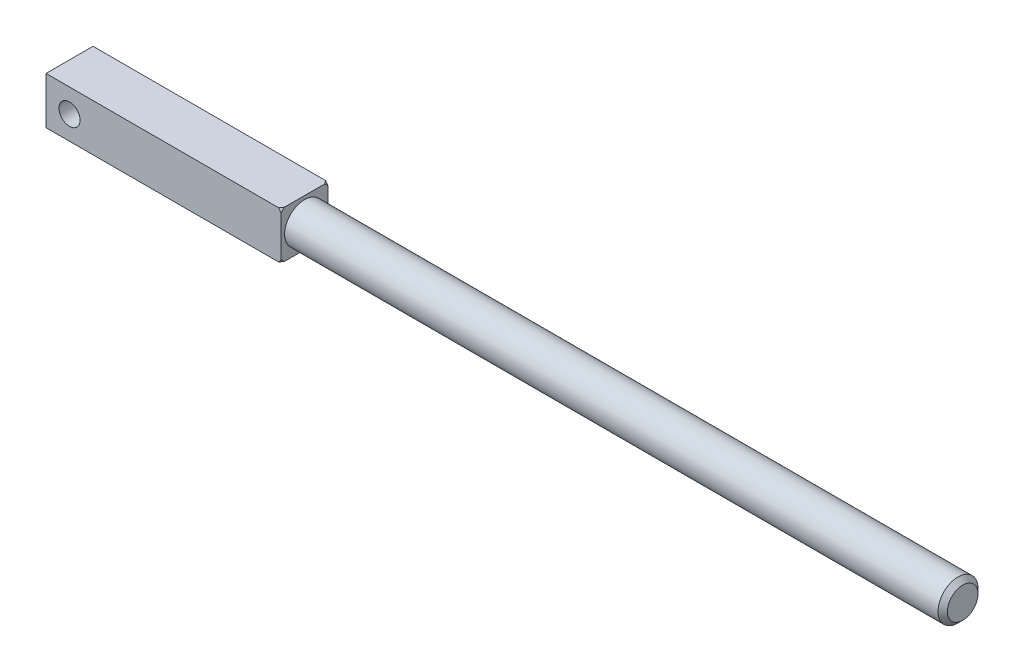
ISO-10303-21;
HEADER;
FILE_DESCRIPTION(('STEP AP214'),'2;1');
FILE_NAME('part.step','',(''),(''),'','','');
FILE_SCHEMA(('AUTOMOTIVE_DESIGN { 1 0 10303 214 1 1 1 1 }'));
ENDSEC;
DATA;
#1=APPLICATION_CONTEXT('core data for automotive mechanical design processes');
#2=APPLICATION_PROTOCOL_DEFINITION('international standard','automotive_design',2000,#1);
#3=PRODUCT_CONTEXT('',#1,'mechanical');
#4=PRODUCT('Part','Part','',(#3));
#5=PRODUCT_RELATED_PRODUCT_CATEGORY('part','',(#4));
#6=PRODUCT_DEFINITION_FORMATION('','',#4);
#7=PRODUCT_DEFINITION_CONTEXT('part definition',#1,'design');
#8=PRODUCT_DEFINITION('design','',#6,#7);
#9=PRODUCT_DEFINITION_SHAPE('','',#8);
#10=(LENGTH_UNIT() NAMED_UNIT(*) SI_UNIT(.MILLI.,.METRE.));
#11=(NAMED_UNIT(*) PLANE_ANGLE_UNIT() SI_UNIT($,.RADIAN.));
#12=(NAMED_UNIT(*) SI_UNIT($,.STERADIAN.) SOLID_ANGLE_UNIT());
#13=UNCERTAINTY_MEASURE_WITH_UNIT(LENGTH_MEASURE(1.E-05),#10,'distance_accuracy_value','');
#14=(GEOMETRIC_REPRESENTATION_CONTEXT(3) GLOBAL_UNCERTAINTY_ASSIGNED_CONTEXT((#13)) GLOBAL_UNIT_ASSIGNED_CONTEXT((#10,
#11,#12)) REPRESENTATION_CONTEXT('',''));
#15=CARTESIAN_POINT('',(0.,0.,0.));
#16=DIRECTION('',(0.,0.,1.));
#17=DIRECTION('',(1.,0.,0.));
#18=AXIS2_PLACEMENT_3D('',#15,#16,#17);
#19=CARTESIAN_POINT('',(50.,0.,0.));
#20=DIRECTION('',(1.,0.,0.));
#21=DIRECTION('',(0.,0.,-1.));
#22=AXIS2_PLACEMENT_3D('',#19,#20,#21);
#23=PLANE('',#22);
#24=CARTESIAN_POINT('',(50.,0.,0.));
#25=DIRECTION('',(1.,0.,0.));
#26=DIRECTION('',(0.,0.,-1.));
#27=AXIS2_PLACEMENT_3D('',#24,#25,#26);
#28=CIRCLE('',#27,4.25);
#29=CARTESIAN_POINT('',(50.,0.,-4.25));
#30=VERTEX_POINT('',#29);
#31=EDGE_CURVE('E152',#30,#30,#28,.T.);
#32=ORIENTED_EDGE('',*,*,#31,.F.);
#33=EDGE_LOOP('',(#32));
#34=FACE_BOUND('',#33,.T.);
#35=CARTESIAN_POINT('',(50.,0.,0.));
#36=DIRECTION('',(1.,0.,0.));
#37=DIRECTION('',(0.,0.,-1.));
#38=AXIS2_PLACEMENT_3D('',#35,#36,#37);
#39=CIRCLE('',#38,6.57106781186548);
#40=CARTESIAN_POINT('',(50.,-4.2636759009257,-5.));
#41=VERTEX_POINT('',#40);
#42=CARTESIAN_POINT('',(50.,-5.,-4.26367590092569));
#43=VERTEX_POINT('',#42);
#44=EDGE_CURVE('E11',#41,#43,#39,.F.);
#45=ORIENTED_EDGE('',*,*,#44,.F.);
#46=DIRECTION('',(0.,1.,0.));
#47=VECTOR('',#46,1.);
#48=CARTESIAN_POINT('',(50.,5.,-5.));
#49=LINE('',#48,#47);
#50=CARTESIAN_POINT('',(50.,4.2636759009257,-5.));
#51=VERTEX_POINT('',#50);
#52=EDGE_CURVE('E144',#41,#51,#49,.T.);
#53=ORIENTED_EDGE('',*,*,#52,.T.);
#54=CARTESIAN_POINT('',(50.,5.,-4.26367590092569));
#55=VERTEX_POINT('',#54);
#56=EDGE_CURVE('E56',#55,#51,#39,.F.);
#57=ORIENTED_EDGE('',*,*,#56,.F.);
#58=DIRECTION('',(0.,0.,1.));
#59=VECTOR('',#58,1.);
#60=CARTESIAN_POINT('',(50.,5.,5.));
#61=LINE('',#60,#59);
#62=CARTESIAN_POINT('',(50.,5.,4.26367590092569));
#63=VERTEX_POINT('',#62);
#64=EDGE_CURVE('E140',#55,#63,#61,.T.);
#65=ORIENTED_EDGE('',*,*,#64,.T.);
#66=CARTESIAN_POINT('',(50.,0.,0.));
#67=DIRECTION('',(-1.,0.,0.));
#68=DIRECTION('',(0.,0.,1.));
#69=AXIS2_PLACEMENT_3D('',#66,#67,#68);
#70=CIRCLE('',#69,6.57106781186548);
#71=CARTESIAN_POINT('',(50.,4.26367590092569,5.));
#72=VERTEX_POINT('',#71);
#73=EDGE_CURVE('E116',#72,#63,#70,.T.);
#74=ORIENTED_EDGE('',*,*,#73,.F.);
#75=DIRECTION('',(0.,-1.,0.));
#76=VECTOR('',#75,1.);
#77=CARTESIAN_POINT('',(50.,5.,5.));
#78=LINE('',#77,#76);
#79=CARTESIAN_POINT('',(50.,-4.2636759009257,5.));
#80=VERTEX_POINT('',#79);
#81=EDGE_CURVE('E132',#72,#80,#78,.T.);
#82=ORIENTED_EDGE('',*,*,#81,.T.);
#83=CARTESIAN_POINT('',(50.,-5.,4.26367590092569));
#84=VERTEX_POINT('',#83);
#85=EDGE_CURVE('E55',#84,#80,#39,.F.);
#86=ORIENTED_EDGE('',*,*,#85,.F.);
#87=DIRECTION('',(0.,0.,-1.));
#88=VECTOR('',#87,1.);
#89=CARTESIAN_POINT('',(50.,-5.,5.));
#90=LINE('',#89,#88);
#91=EDGE_CURVE('E168',#84,#43,#90,.T.);
#92=ORIENTED_EDGE('',*,*,#91,.T.);
#93=EDGE_LOOP('',(#45,#53,#57,#65,#74,#82,#86,#92));
#94=FACE_BOUND('',#93,.T.);
#95=ADVANCED_FACE('F45',(#34,#94),#23,.T.);
#96=CARTESIAN_POINT('',(50.,5.,5.));
#97=DIRECTION('',(0.,0.,-1.));
#98=DIRECTION('',(0.,1.,0.));
#99=AXIS2_PLACEMENT_3D('',#96,#97,#98);
#100=PLANE('',#99);
#101=CARTESIAN_POINT('',(5.,0.,5.));
#102=DIRECTION('',(0.,0.,-1.));
#103=DIRECTION('',(0.,1.,0.));
#104=AXIS2_PLACEMENT_3D('',#101,#102,#103);
#105=CIRCLE('',#104,2.25);
#106=CARTESIAN_POINT('',(5.,2.25,5.));
#107=VERTEX_POINT('',#106);
#108=EDGE_CURVE('E282',#107,#107,#105,.T.);
#109=ORIENTED_EDGE('',*,*,#108,.T.);
#110=EDGE_LOOP('',(#109));
#111=FACE_BOUND('',#110,.T.);
#112=DIRECTION('',(-1.,0.,0.));
#113=VECTOR('',#112,1.);
#114=CARTESIAN_POINT('',(50.,-5.,5.));
#115=LINE('',#114,#113);
#116=CARTESIAN_POINT('',(49.5,-5.,5.));
#117=VERTEX_POINT('',#116);
#118=CARTESIAN_POINT('',(0.,-5.,5.));
#119=VERTEX_POINT('',#118);
#120=EDGE_CURVE('E150',#117,#119,#115,.T.);
#121=ORIENTED_EDGE('',*,*,#120,.F.);
#122=CARTESIAN_POINT('',(49.4995050079303,-5.0007,5.));
#123=CARTESIAN_POINT('',(49.5983002093079,-4.86094694822698,5.));
#124=CARTESIAN_POINT('',(49.6957664127101,-4.72023218109498,5.));
#125=CARTESIAN_POINT('',(49.8874043165324,-4.43648825547117,5.));
#126=CARTESIAN_POINT('',(49.9815745163635,-4.29345808508102,5.));
#127=CARTESIAN_POINT('',(50.1670447929259,-4.00301511145416,5.));
#128=CARTESIAN_POINT('',(50.2582943395657,-3.8555698831424,5.));
#129=CARTESIAN_POINT('',(50.4357091272696,-3.5576611397577,5.));
#130=CARTESIAN_POINT('',(50.5218749491828,-3.40719797214674,5.));
#131=CARTESIAN_POINT('',(50.6905310765116,-3.09806638656955,5.));
#132=CARTESIAN_POINT('',(50.7728221648616,-2.93928851918819,5.));
#133=CARTESIAN_POINT('',(50.9290713753445,-2.61761159970518,5.));
#134=CARTESIAN_POINT('',(51.0030279142447,-2.45471177176753,5.));
#135=CARTESIAN_POINT('',(51.1401605213441,-2.12533625128884,5.));
#136=CARTESIAN_POINT('',(51.2033882309188,-1.958882297305,5.));
#137=CARTESIAN_POINT('',(51.3170411547423,-1.62171031474367,5.));
#138=CARTESIAN_POINT('',(51.3674744138662,-1.45099504014529,5.));
#139=CARTESIAN_POINT('',(51.4506842361065,-1.115049617912,5.));
#140=CARTESIAN_POINT('',(51.4842683916634,-0.950022348143992,5.));
#141=CARTESIAN_POINT('',(51.5357634585119,-0.617454860937149,5.));
#142=CARTESIAN_POINT('',(51.5536709491817,-0.449914103167076,5.));
#143=CARTESIAN_POINT('',(51.5724521738729,-0.116223867603862,5.));
#144=CARTESIAN_POINT('',(51.5735614547375,0.0499121333166555,5.));
#145=CARTESIAN_POINT('',(51.5592743847755,0.381460293449463,5.));
#146=CARTESIAN_POINT('',(51.5438779559998,0.546872449239654,5.));
#147=CARTESIAN_POINT('',(51.4977657526018,0.874372688355075,5.));
#148=CARTESIAN_POINT('',(51.4671535177563,1.03647563249434,5.));
#149=CARTESIAN_POINT('',(51.3924165889719,1.35750716163571,5.));
#150=CARTESIAN_POINT('',(51.3482901363844,1.51643533062509,5.));
#151=CARTESIAN_POINT('',(51.2479252265193,1.83265984283318,5.));
#152=CARTESIAN_POINT('',(51.1915361009466,1.9899077607774,5.));
#153=CARTESIAN_POINT('',(51.0690618215342,2.30053076507769,5.));
#154=CARTESIAN_POINT('',(51.0029768807588,2.45390593645009,5.));
#155=CARTESIAN_POINT('',(50.8337349293357,2.82016104206882,5.));
#156=CARTESIAN_POINT('',(50.7266067143713,3.03119784345134,5.));
#157=CARTESIAN_POINT('',(50.5005687206453,3.4469404916459,5.));
#158=CARTESIAN_POINT('',(50.3816512660756,3.6516420983929,5.));
#159=CARTESIAN_POINT('',(50.1387662698281,4.0495131372897,5.));
#160=CARTESIAN_POINT('',(50.0150615281737,4.24284401624062,5.));
#161=CARTESIAN_POINT('',(49.8248671158051,4.52949241426085,5.));
#162=CARTESIAN_POINT('',(49.7607540512441,4.62440253770347,5.));
#163=CARTESIAN_POINT('',(49.6311330621438,4.81325257885407,5.));
#164=CARTESIAN_POINT('',(49.5656252728845,4.90719258935653,5.));
#165=CARTESIAN_POINT('',(49.4995050079303,5.0007,5.));
#166=B_SPLINE_CURVE_WITH_KNOTS('',3,(#122,#123,#124,#125,#126,#127,#128,#129,#130,#131,#132,
#133,#134,#135,#136,#137,#138,#139,#140,#141,#142,#143,#144,#145,#146,#147,#148,#149,#150,#151,
#152,#153,#154,#155,#156,#157,#158,#159,#160,#161,#162,#163,#164,#165),.UNSPECIFIED.,.F.,.F.,(4,
2,2,2,2,2,2,2,2,2,2,2,2,2,2,2,2,2,2,2,2,4),(0.,0.513461120832241,1.02715304499042,
1.54726016420923,2.06730774222379,2.60361890691102,3.14003177826827,3.67378459224439,
4.20720095743628,4.71176064483711,5.21643039888602,5.71401694478721,6.21160584057641,
6.70585419207092,7.20016688904411,7.70093584569957,8.20169379966848,8.9111679597023,
9.62110712055915,10.3095000713479,10.6530974739341,10.996661700078),.UNSPECIFIED.);
#167=EDGE_CURVE('E134',#117,#80,#166,.T.);
#168=ORIENTED_EDGE('',*,*,#167,.T.);
#169=ORIENTED_EDGE('',*,*,#81,.F.);
#170=CARTESIAN_POINT('',(49.5,5.,5.));
#171=VERTEX_POINT('',#170);
#172=EDGE_CURVE('E114',#72,#171,#166,.T.);
#173=ORIENTED_EDGE('',*,*,#172,.T.);
#174=DIRECTION('',(-1.,0.,0.));
#175=VECTOR('',#174,1.);
#176=CARTESIAN_POINT('',(50.,5.,5.));
#177=LINE('',#176,#175);
#178=CARTESIAN_POINT('',(0.,5.,5.));
#179=VERTEX_POINT('',#178);
#180=EDGE_CURVE('E128',#171,#179,#177,.T.);
#181=ORIENTED_EDGE('',*,*,#180,.T.);
#182=DIRECTION('',(0.,-1.,0.));
#183=VECTOR('',#182,1.);
#184=CARTESIAN_POINT('',(0.,5.,5.));
#185=LINE('',#184,#183);
#186=EDGE_CURVE('E167',#179,#119,#185,.T.);
#187=ORIENTED_EDGE('',*,*,#186,.T.);
#188=EDGE_LOOP('',(#121,#168,#169,#173,#181,#187));
#189=FACE_BOUND('',#188,.T.);
#190=ADVANCED_FACE('F126',(#111,#189),#100,.F.);
#191=CARTESIAN_POINT('',(50.,-5.,5.));
#192=DIRECTION('',(0.,1.,0.));
#193=DIRECTION('',(0.,0.,1.));
#194=AXIS2_PLACEMENT_3D('',#191,#192,#193);
#195=PLANE('',#194);
#196=DIRECTION('',(-1.,0.,0.));
#197=VECTOR('',#196,1.);
#198=CARTESIAN_POINT('',(50.,-5.,-5.));
#199=LINE('',#198,#197);
#200=CARTESIAN_POINT('',(49.5,-5.,-5.));
#201=VERTEX_POINT('',#200);
#202=CARTESIAN_POINT('',(0.,-5.,-5.));
#203=VERTEX_POINT('',#202);
#204=EDGE_CURVE('E142',#201,#203,#199,.T.);
#205=ORIENTED_EDGE('',*,*,#204,.F.);
#206=CARTESIAN_POINT('',(49.4995050079303,-5.,-5.0007));
#207=CARTESIAN_POINT('',(49.5983002093079,-5.,-4.86094694822698));
#208=CARTESIAN_POINT('',(49.6957664127101,-5.,-4.72023218109498));
#209=CARTESIAN_POINT('',(49.8874043165324,-5.,-4.43648825547117));
#210=CARTESIAN_POINT('',(49.9815745163635,-5.,-4.29345808508103));
#211=CARTESIAN_POINT('',(50.1670447929259,-5.,-4.00301511145417));
#212=CARTESIAN_POINT('',(50.2582943395657,-5.,-3.85556988314241));
#213=CARTESIAN_POINT('',(50.4357091272696,-5.,-3.55766113975771));
#214=CARTESIAN_POINT('',(50.5218749491828,-5.,-3.40719797214675));
#215=CARTESIAN_POINT('',(50.6905310765116,-5.,-3.09806638656956));
#216=CARTESIAN_POINT('',(50.7728221648616,-5.,-2.9392885191882));
#217=CARTESIAN_POINT('',(50.9290713753445,-5.,-2.61761159970518));
#218=CARTESIAN_POINT('',(51.0030279142447,-5.,-2.45471177176754));
#219=CARTESIAN_POINT('',(51.1401605213441,-5.,-2.12533625128884));
#220=CARTESIAN_POINT('',(51.2033882309188,-5.,-1.95888229730501));
#221=CARTESIAN_POINT('',(51.3170411547423,-5.,-1.62171031474367));
#222=CARTESIAN_POINT('',(51.3674744138662,-5.,-1.45099504014529));
#223=CARTESIAN_POINT('',(51.4506842361065,-5.,-1.115049617912));
#224=CARTESIAN_POINT('',(51.4842683916634,-5.,-0.950022348143991));
#225=CARTESIAN_POINT('',(51.5357634585119,-5.,-0.617454860937147));
#226=CARTESIAN_POINT('',(51.5536709491817,-5.,-0.449914103167075));
#227=CARTESIAN_POINT('',(51.5724521738729,-5.,-0.11622386760386));
#228=CARTESIAN_POINT('',(51.5735614547375,-5.,0.0499121333166572));
#229=CARTESIAN_POINT('',(51.5592743847755,-5.,0.381460293449465));
#230=CARTESIAN_POINT('',(51.5438779559998,-5.,0.546872449239655));
#231=CARTESIAN_POINT('',(51.4977657526018,-5.,0.874372688355076));
#232=CARTESIAN_POINT('',(51.4671535177563,-5.,1.03647563249434));
#233=CARTESIAN_POINT('',(51.3924165889719,-5.,1.35750716163571));
#234=CARTESIAN_POINT('',(51.3482901363844,-5.,1.51643533062509));
#235=CARTESIAN_POINT('',(51.2479252265193,-5.,1.83265984283319));
#236=CARTESIAN_POINT('',(51.1915361009466,-5.,1.98990776077741));
#237=CARTESIAN_POINT('',(51.0690618215342,-5.,2.3005307650777));
#238=CARTESIAN_POINT('',(51.0029768807588,-5.,2.4539059364501));
#239=CARTESIAN_POINT('',(50.8337349293357,-5.,2.82016104206882));
#240=CARTESIAN_POINT('',(50.7266067143713,-5.,3.03119784345135));
#241=CARTESIAN_POINT('',(50.5005687206453,-5.,3.4469404916459));
#242=CARTESIAN_POINT('',(50.3816512660756,-5.,3.6516420983929));
#243=CARTESIAN_POINT('',(50.1387662698281,-5.,4.04951313728969));
#244=CARTESIAN_POINT('',(50.0150615281737,-5.,4.24284401624061));
#245=CARTESIAN_POINT('',(49.8248671158051,-5.,4.52949241426084));
#246=CARTESIAN_POINT('',(49.7607540512441,-5.,4.62440253770346));
#247=CARTESIAN_POINT('',(49.6311330621438,-5.,4.81325257885407));
#248=CARTESIAN_POINT('',(49.5656252728845,-5.,4.90719258935653));
#249=CARTESIAN_POINT('',(49.4995050079303,-5.,5.0007));
#250=B_SPLINE_CURVE_WITH_KNOTS('',3,(#206,#207,#208,#209,#210,#211,#212,#213,#214,#215,#216,
#217,#218,#219,#220,#221,#222,#223,#224,#225,#226,#227,#228,#229,#230,#231,#232,#233,#234,#235,
#236,#237,#238,#239,#240,#241,#242,#243,#244,#245,#246,#247,#248,#249),.UNSPECIFIED.,.F.,.F.,(4,
2,2,2,2,2,2,2,2,2,2,2,2,2,2,2,2,2,2,2,2,4),(0.,0.513461120832243,1.02715304499042,
1.54726016420922,2.06730774222379,2.60361890691102,3.14003177826827,3.67378459224439,
4.20720095743628,4.71176064483712,5.21643039888603,5.71401694478722,6.21160584057642,
6.70585419207093,7.20016688904411,7.70093584569959,8.20169379966849,8.91116795970231,
9.62110712055915,10.3095000713479,10.6530974739342,10.996661700078),.UNSPECIFIED.);
#251=EDGE_CURVE('E192',#201,#43,#250,.T.);
#252=ORIENTED_EDGE('',*,*,#251,.T.);
#253=ORIENTED_EDGE('',*,*,#91,.F.);
#254=EDGE_CURVE('E163',#84,#117,#250,.T.);
#255=ORIENTED_EDGE('',*,*,#254,.T.);
#256=ORIENTED_EDGE('',*,*,#120,.T.);
#257=DIRECTION('',(0.,0.,-1.));
#258=VECTOR('',#257,1.);
#259=CARTESIAN_POINT('',(0.,-5.,5.));
#260=LINE('',#259,#258);
#261=EDGE_CURVE('E178',#119,#203,#260,.T.);
#262=ORIENTED_EDGE('',*,*,#261,.T.);
#263=EDGE_LOOP('',(#205,#252,#253,#255,#256,#262));
#264=FACE_BOUND('',#263,.T.);
#265=ADVANCED_FACE('F190',(#264),#195,.F.);
#266=CARTESIAN_POINT('',(50.,5.,-5.));
#267=DIRECTION('',(0.,0.,1.));
#268=DIRECTION('',(0.,-1.,0.));
#269=AXIS2_PLACEMENT_3D('',#266,#267,#268);
#270=PLANE('',#269);
#271=CARTESIAN_POINT('',(5.,0.,-5.));
#272=DIRECTION('',(0.,0.,-1.));
#273=DIRECTION('',(0.,1.,0.));
#274=AXIS2_PLACEMENT_3D('',#271,#272,#273);
#275=CIRCLE('',#274,4.);
#276=CARTESIAN_POINT('',(5.,4.,-5.));
#277=VERTEX_POINT('',#276);
#278=EDGE_CURVE('E281',#277,#277,#275,.T.);
#279=ORIENTED_EDGE('',*,*,#278,.F.);
#280=EDGE_LOOP('',(#279));
#281=FACE_BOUND('',#280,.T.);
#282=DIRECTION('',(-1.,0.,0.));
#283=VECTOR('',#282,1.);
#284=CARTESIAN_POINT('',(50.,5.,-5.));
#285=LINE('',#284,#283);
#286=CARTESIAN_POINT('',(49.5,5.,-5.));
#287=VERTEX_POINT('',#286);
#288=CARTESIAN_POINT('',(0.,5.,-5.));
#289=VERTEX_POINT('',#288);
#290=EDGE_CURVE('E139',#287,#289,#285,.T.);
#291=ORIENTED_EDGE('',*,*,#290,.F.);
#292=CARTESIAN_POINT('',(49.4995050079303,5.0007,-5.));
#293=CARTESIAN_POINT('',(49.5983002093079,4.86094694822698,-5.));
#294=CARTESIAN_POINT('',(49.6957664127101,4.72023218109498,-5.));
#295=CARTESIAN_POINT('',(49.8874043165324,4.43648825547117,-5.));
#296=CARTESIAN_POINT('',(49.9815745163635,4.29345808508103,-5.));
#297=CARTESIAN_POINT('',(50.1670447929259,4.00301511145416,-5.));
#298=CARTESIAN_POINT('',(50.2582943395657,3.8555698831424,-5.));
#299=CARTESIAN_POINT('',(50.4357091272696,3.55766113975771,-5.));
#300=CARTESIAN_POINT('',(50.5218749491828,3.40719797214675,-5.));
#301=CARTESIAN_POINT('',(50.6905310765116,3.09806638656956,-5.));
#302=CARTESIAN_POINT('',(50.7728221648616,2.9392885191882,-5.));
#303=CARTESIAN_POINT('',(50.9290713753445,2.61761159970518,-5.));
#304=CARTESIAN_POINT('',(51.0030279142447,2.45471177176754,-5.));
#305=CARTESIAN_POINT('',(51.1401605213441,2.12533625128884,-5.));
#306=CARTESIAN_POINT('',(51.2033882309188,1.95888229730501,-5.));
#307=CARTESIAN_POINT('',(51.3170411547423,1.62171031474367,-5.));
#308=CARTESIAN_POINT('',(51.3674744138661,1.45099504014529,-5.));
#309=CARTESIAN_POINT('',(51.4506842361065,1.115049617912,-5.));
#310=CARTESIAN_POINT('',(51.4842683916634,0.950022348143993,-5.));
#311=CARTESIAN_POINT('',(51.5357634585119,0.61745486093715,-5.));
#312=CARTESIAN_POINT('',(51.5536709491817,0.449914103167078,-5.));
#313=CARTESIAN_POINT('',(51.5724521738729,0.116223867603863,-5.));
#314=CARTESIAN_POINT('',(51.5735614547375,-0.0499121333166543,-5.));
#315=CARTESIAN_POINT('',(51.5592743847755,-0.381460293449462,-5.));
#316=CARTESIAN_POINT('',(51.5438779559998,-0.546872449239653,-5.));
#317=CARTESIAN_POINT('',(51.4977657526018,-0.874372688355074,-5.));
#318=CARTESIAN_POINT('',(51.4671535177563,-1.03647563249434,-5.));
#319=CARTESIAN_POINT('',(51.3924165889719,-1.35750716163571,-5.));
#320=CARTESIAN_POINT('',(51.3482901363844,-1.51643533062509,-5.));
#321=CARTESIAN_POINT('',(51.2479252265193,-1.83265984283318,-5.));
#322=CARTESIAN_POINT('',(51.1915361009466,-1.98990776077741,-5.));
#323=CARTESIAN_POINT('',(51.0690618215342,-2.3005307650777,-5.));
#324=CARTESIAN_POINT('',(51.0029768807588,-2.4539059364501,-5.));
#325=CARTESIAN_POINT('',(50.8337349293357,-2.82016104206881,-5.));
#326=CARTESIAN_POINT('',(50.7266067143713,-3.03119784345134,-5.));
#327=CARTESIAN_POINT('',(50.5005687206453,-3.4469404916459,-5.));
#328=CARTESIAN_POINT('',(50.3816512660756,-3.6516420983929,-5.));
#329=CARTESIAN_POINT('',(50.1387662698281,-4.0495131372897,-5.));
#330=CARTESIAN_POINT('',(50.0150615281737,-4.24284401624062,-5.));
#331=CARTESIAN_POINT('',(49.8248671158051,-4.52949241426085,-5.));
#332=CARTESIAN_POINT('',(49.7607540512441,-4.62440253770347,-5.));
#333=CARTESIAN_POINT('',(49.6311330621438,-4.81325257885407,-5.));
#334=CARTESIAN_POINT('',(49.5656252728844,-4.90719258935653,-5.));
#335=CARTESIAN_POINT('',(49.4995050079303,-5.0007,-5.));
#336=B_SPLINE_CURVE_WITH_KNOTS('',3,(#292,#293,#294,#295,#296,#297,#298,#299,#300,#301,#302,
#303,#304,#305,#306,#307,#308,#309,#310,#311,#312,#313,#314,#315,#316,#317,#318,#319,#320,#321,
#322,#323,#324,#325,#326,#327,#328,#329,#330,#331,#332,#333,#334,#335),.UNSPECIFIED.,.F.,.F.,(4,
2,2,2,2,2,2,2,2,2,2,2,2,2,2,2,2,2,2,2,2,4),(0.,0.513461120832242,1.02715304499042,
1.54726016420923,2.06730774222379,2.60361890691102,3.14003177826827,3.67378459224439,
4.20720095743628,4.71176064483712,5.21643039888603,5.71401694478722,6.21160584057642,
6.70585419207093,7.20016688904411,7.70093584569958,8.20169379966849,8.9111679597023,
9.62110712055916,10.3095000713479,10.6530974739342,10.996661700078),.UNSPECIFIED.);
#337=EDGE_CURVE('E121',#287,#51,#336,.T.);
#338=ORIENTED_EDGE('',*,*,#337,.T.);
#339=ORIENTED_EDGE('',*,*,#52,.F.);
#340=EDGE_CURVE('E70',#41,#201,#336,.T.);
#341=ORIENTED_EDGE('',*,*,#340,.T.);
#342=ORIENTED_EDGE('',*,*,#204,.T.);
#343=DIRECTION('',(0.,1.,0.));
#344=VECTOR('',#343,1.);
#345=CARTESIAN_POINT('',(0.,5.,-5.));
#346=LINE('',#345,#344);
#347=EDGE_CURVE('E171',#203,#289,#346,.T.);
#348=ORIENTED_EDGE('',*,*,#347,.T.);
#349=EDGE_LOOP('',(#291,#338,#339,#341,#342,#348));
#350=FACE_BOUND('',#349,.T.);
#351=ADVANCED_FACE('F184',(#281,#350),#270,.F.);
#352=CARTESIAN_POINT('',(50.,5.,5.));
#353=DIRECTION('',(0.,-1.,0.));
#354=DIRECTION('',(0.,0.,-1.));
#355=AXIS2_PLACEMENT_3D('',#352,#353,#354);
#356=PLANE('',#355);
#357=ORIENTED_EDGE('',*,*,#180,.F.);
#358=CARTESIAN_POINT('',(49.4995050079303,5.,5.0007));
#359=CARTESIAN_POINT('',(49.5983002093079,5.,4.86094694822698));
#360=CARTESIAN_POINT('',(49.6957664127101,5.,4.72023218109498));
#361=CARTESIAN_POINT('',(49.8874043165324,5.,4.43648825547117));
#362=CARTESIAN_POINT('',(49.9815745163635,5.,4.29345808508102));
#363=CARTESIAN_POINT('',(50.1670447929259,5.,4.00301511145416));
#364=CARTESIAN_POINT('',(50.2582943395657,5.,3.8555698831424));
#365=CARTESIAN_POINT('',(50.4357091272696,5.,3.5576611397577));
#366=CARTESIAN_POINT('',(50.5218749491828,5.,3.40719797214674));
#367=CARTESIAN_POINT('',(50.6905310765116,5.,3.09806638656955));
#368=CARTESIAN_POINT('',(50.7728221648616,5.,2.93928851918819));
#369=CARTESIAN_POINT('',(50.9290713753445,5.,2.61761159970518));
#370=CARTESIAN_POINT('',(51.0030279142447,5.,2.45471177176753));
#371=CARTESIAN_POINT('',(51.1401605213441,5.,2.12533625128884));
#372=CARTESIAN_POINT('',(51.2033882309188,5.,1.95888229730501));
#373=CARTESIAN_POINT('',(51.3170411547423,5.,1.62171031474367));
#374=CARTESIAN_POINT('',(51.3674744138662,5.,1.45099504014529));
#375=CARTESIAN_POINT('',(51.4506842361065,5.,1.115049617912));
#376=CARTESIAN_POINT('',(51.4842683916634,5.,0.95002234814399));
#377=CARTESIAN_POINT('',(51.5357634585119,5.,0.617454860937146));
#378=CARTESIAN_POINT('',(51.5536709491817,5.,0.449914103167074));
#379=CARTESIAN_POINT('',(51.5724521738729,5.,0.116223867603859));
#380=CARTESIAN_POINT('',(51.5735614547375,5.,-0.049912133316658));
#381=CARTESIAN_POINT('',(51.5592743847755,5.,-0.381460293449465));
#382=CARTESIAN_POINT('',(51.5438779559998,5.,-0.546872449239656));
#383=CARTESIAN_POINT('',(51.4977657526018,5.,-0.874372688355077));
#384=CARTESIAN_POINT('',(51.4671535177563,5.,-1.03647563249434));
#385=CARTESIAN_POINT('',(51.3924165889719,5.,-1.35750716163571));
#386=CARTESIAN_POINT('',(51.3482901363844,5.,-1.51643533062509));
#387=CARTESIAN_POINT('',(51.2479252265193,5.,-1.83265984283319));
#388=CARTESIAN_POINT('',(51.1915361009466,5.,-1.98990776077741));
#389=CARTESIAN_POINT('',(51.0690618215342,5.,-2.3005307650777));
#390=CARTESIAN_POINT('',(51.0029768807588,5.,-2.4539059364501));
#391=CARTESIAN_POINT('',(50.8337349293357,5.,-2.82016104206882));
#392=CARTESIAN_POINT('',(50.7266067143713,5.,-3.03119784345134));
#393=CARTESIAN_POINT('',(50.5005687206453,5.,-3.4469404916459));
#394=CARTESIAN_POINT('',(50.3816512660756,5.,-3.6516420983929));
#395=CARTESIAN_POINT('',(50.1387662698281,5.,-4.04951313728969));
#396=CARTESIAN_POINT('',(50.0150615281737,5.,-4.24284401624062));
#397=CARTESIAN_POINT('',(49.8248671158051,5.,-4.52949241426085));
#398=CARTESIAN_POINT('',(49.7607540512441,5.,-4.62440253770347));
#399=CARTESIAN_POINT('',(49.6311330621438,5.,-4.81325257885407));
#400=CARTESIAN_POINT('',(49.5656252728844,5.,-4.90719258935653));
#401=CARTESIAN_POINT('',(49.4995050079303,5.,-5.0007));
#402=B_SPLINE_CURVE_WITH_KNOTS('',3,(#358,#359,#360,#361,#362,#363,#364,#365,#366,#367,#368,
#369,#370,#371,#372,#373,#374,#375,#376,#377,#378,#379,#380,#381,#382,#383,#384,#385,#386,#387,
#388,#389,#390,#391,#392,#393,#394,#395,#396,#397,#398,#399,#400,#401),.UNSPECIFIED.,.F.,.F.,(4,
2,2,2,2,2,2,2,2,2,2,2,2,2,2,2,2,2,2,2,2,4),(0.,0.513461120832248,1.02715304499042,
1.54726016420923,2.06730774222379,2.60361890691102,3.14003177826827,3.67378459224439,
4.20720095743628,4.71176064483712,5.21643039888603,5.71401694478722,6.21160584057642,
6.70585419207093,7.20016688904412,7.70093584569958,8.20169379966849,8.9111679597023,
9.62110712055916,10.3095000713479,10.6530974739342,10.996661700078),.UNSPECIFIED.);
#403=EDGE_CURVE('E111',#171,#63,#402,.T.);
#404=ORIENTED_EDGE('',*,*,#403,.T.);
#405=ORIENTED_EDGE('',*,*,#64,.F.);
#406=EDGE_CURVE('E63',#55,#287,#402,.T.);
#407=ORIENTED_EDGE('',*,*,#406,.T.);
#408=ORIENTED_EDGE('',*,*,#290,.T.);
#409=DIRECTION('',(0.,0.,1.));
#410=VECTOR('',#409,1.);
#411=CARTESIAN_POINT('',(0.,5.,5.));
#412=LINE('',#411,#410);
#413=EDGE_CURVE('E137',#289,#179,#412,.T.);
#414=ORIENTED_EDGE('',*,*,#413,.T.);
#415=EDGE_LOOP('',(#357,#404,#405,#407,#408,#414));
#416=FACE_BOUND('',#415,.T.);
#417=ADVANCED_FACE('F135',(#416),#356,.F.);
#418=CARTESIAN_POINT('',(0.,0.,0.));
#419=DIRECTION('',(1.,0.,0.));
#420=DIRECTION('',(0.,0.,-1.));
#421=AXIS2_PLACEMENT_3D('',#418,#419,#420);
#422=PLANE('',#421);
#423=ORIENTED_EDGE('',*,*,#186,.F.);
#424=ORIENTED_EDGE('',*,*,#413,.F.);
#425=ORIENTED_EDGE('',*,*,#347,.F.);
#426=ORIENTED_EDGE('',*,*,#261,.F.);
#427=EDGE_LOOP('',(#423,#424,#425,#426));
#428=FACE_BOUND('',#427,.T.);
#429=ADVANCED_FACE('F188',(#428),#422,.F.);
#430=CARTESIAN_POINT('',(190.,0.,0.));
#431=DIRECTION('',(-1.,0.,0.));
#432=DIRECTION('',(0.,0.,1.));
#433=AXIS2_PLACEMENT_3D('',#430,#431,#432);
#434=CYLINDRICAL_SURFACE('',#433,4.25);
#435=CARTESIAN_POINT('',(189.,0.,0.));
#436=DIRECTION('',(1.,0.,0.));
#437=DIRECTION('',(0.,0.,-1.));
#438=AXIS2_PLACEMENT_3D('',#435,#436,#437);
#439=CIRCLE('',#438,4.25);
#440=CARTESIAN_POINT('',(189.,0.,-4.25));
#441=VERTEX_POINT('',#440);
#442=EDGE_CURVE('E156',#441,#441,#439,.F.);
#443=ORIENTED_EDGE('',*,*,#442,.T.);
#444=EDGE_LOOP('',(#443));
#445=FACE_BOUND('',#444,.T.);
#446=ORIENTED_EDGE('',*,*,#31,.T.);
#447=EDGE_LOOP('',(#446));
#448=FACE_BOUND('',#447,.T.);
#449=ADVANCED_FACE('F237',(#445,#448),#434,.T.);
#450=CARTESIAN_POINT('',(190.,0.,0.));
#451=DIRECTION('',(1.,0.,0.));
#452=DIRECTION('',(0.,0.,-1.));
#453=AXIS2_PLACEMENT_3D('',#450,#451,#452);
#454=PLANE('',#453);
#455=CARTESIAN_POINT('',(190.,0.,0.));
#456=DIRECTION('',(1.,0.,0.));
#457=DIRECTION('',(0.,0.,-1.));
#458=AXIS2_PLACEMENT_3D('',#455,#456,#457);
#459=CIRCLE('',#458,3.25000000000003);
#460=CARTESIAN_POINT('',(190.,0.,-3.25000000000003));
#461=VERTEX_POINT('',#460);
#462=EDGE_CURVE('E153',#461,#461,#459,.T.);
#463=ORIENTED_EDGE('',*,*,#462,.T.);
#464=EDGE_LOOP('',(#463));
#465=FACE_BOUND('',#464,.T.);
#466=ADVANCED_FACE('F214',(#465),#454,.T.);
#467=CARTESIAN_POINT('',(190.,0.,0.));
#468=DIRECTION('',(-1.,0.,0.));
#469=DIRECTION('',(0.,0.,1.));
#470=AXIS2_PLACEMENT_3D('',#467,#468,#469);
#471=CONICAL_SURFACE('',#470,3.25000000000003,0.785398163397447);
#472=ORIENTED_EDGE('',*,*,#442,.F.);
#473=EDGE_LOOP('',(#472));
#474=FACE_BOUND('',#473,.T.);
#475=ORIENTED_EDGE('',*,*,#462,.F.);
#476=EDGE_LOOP('',(#475));
#477=FACE_BOUND('',#476,.T.);
#478=ADVANCED_FACE('F48',(#474,#477),#471,.T.);
#479=CARTESIAN_POINT('',(50.,0.,0.));
#480=DIRECTION('',(-1.,0.,0.));
#481=DIRECTION('',(0.,0.,1.));
#482=AXIS2_PLACEMENT_3D('',#479,#480,#481);
#483=CONICAL_SURFACE('',#482,6.57106781186548,0.785398163397449);
#484=ORIENTED_EDGE('',*,*,#406,.F.);
#485=ORIENTED_EDGE('',*,*,#56,.T.);
#486=ORIENTED_EDGE('',*,*,#337,.F.);
#487=EDGE_LOOP('',(#484,#485,#486));
#488=FACE_BOUND('',#487,.T.);
#489=ADVANCED_FACE('F211',(#488),#483,.T.);
#490=ORIENTED_EDGE('',*,*,#73,.T.);
#491=ORIENTED_EDGE('',*,*,#403,.F.);
#492=ORIENTED_EDGE('',*,*,#172,.F.);
#493=EDGE_LOOP('',(#490,#491,#492));
#494=FACE_BOUND('',#493,.T.);
#495=ADVANCED_FACE('F113',(#494),#483,.T.);
#496=ORIENTED_EDGE('',*,*,#254,.F.);
#497=ORIENTED_EDGE('',*,*,#85,.T.);
#498=ORIENTED_EDGE('',*,*,#167,.F.);
#499=EDGE_LOOP('',(#496,#497,#498));
#500=FACE_BOUND('',#499,.T.);
#501=ADVANCED_FACE('F161',(#500),#483,.T.);
#502=ORIENTED_EDGE('',*,*,#340,.F.);
#503=ORIENTED_EDGE('',*,*,#44,.T.);
#504=ORIENTED_EDGE('',*,*,#251,.F.);
#505=EDGE_LOOP('',(#502,#503,#504));
#506=FACE_BOUND('',#505,.T.);
#507=ADVANCED_FACE('F210',(#506),#483,.T.);
#508=CARTESIAN_POINT('',(5.,0.,-0.5));
#509=DIRECTION('',(0.,0.,-1.));
#510=DIRECTION('',(0.,1.,0.));
#511=AXIS2_PLACEMENT_3D('',#508,#509,#510);
#512=CYLINDRICAL_SURFACE('',#511,4.);
#513=CARTESIAN_POINT('',(5.,0.,-0.5));
#514=DIRECTION('',(0.,0.,-1.));
#515=DIRECTION('',(0.,1.,0.));
#516=AXIS2_PLACEMENT_3D('',#513,#514,#515);
#517=CIRCLE('',#516,4.);
#518=CARTESIAN_POINT('',(5.,4.,-0.5));
#519=VERTEX_POINT('',#518);
#520=EDGE_CURVE('E278',#519,#519,#517,.T.);
#521=ORIENTED_EDGE('',*,*,#520,.F.);
#522=EDGE_LOOP('',(#521));
#523=FACE_BOUND('',#522,.T.);
#524=ORIENTED_EDGE('',*,*,#278,.T.);
#525=EDGE_LOOP('',(#524));
#526=FACE_BOUND('',#525,.T.);
#527=ADVANCED_FACE('F212',(#523,#526),#512,.F.);
#528=CARTESIAN_POINT('',(5.,0.,-0.5));
#529=DIRECTION('',(0.,0.,-1.));
#530=DIRECTION('',(0.,1.,0.));
#531=AXIS2_PLACEMENT_3D('',#528,#529,#530);
#532=PLANE('',#531);
#533=CARTESIAN_POINT('',(5.,0.,-0.5));
#534=DIRECTION('',(0.,0.,-1.));
#535=DIRECTION('',(0.,1.,0.));
#536=AXIS2_PLACEMENT_3D('',#533,#534,#535);
#537=CIRCLE('',#536,2.25);
#538=CARTESIAN_POINT('',(5.,2.25,-0.5));
#539=VERTEX_POINT('',#538);
#540=EDGE_CURVE('E50',#539,#539,#537,.T.);
#541=ORIENTED_EDGE('',*,*,#540,.F.);
#542=EDGE_LOOP('',(#541));
#543=FACE_BOUND('',#542,.T.);
#544=ORIENTED_EDGE('',*,*,#520,.T.);
#545=EDGE_LOOP('',(#544));
#546=FACE_BOUND('',#545,.T.);
#547=ADVANCED_FACE('F267',(#543,#546),#532,.T.);
#548=CARTESIAN_POINT('',(5.,0.,15.));
#549=DIRECTION('',(0.,0.,-1.));
#550=DIRECTION('',(0.,1.,0.));
#551=AXIS2_PLACEMENT_3D('',#548,#549,#550);
#552=CYLINDRICAL_SURFACE('',#551,2.25);
#553=ORIENTED_EDGE('',*,*,#540,.T.);
#554=EDGE_LOOP('',(#553));
#555=FACE_BOUND('',#554,.T.);
#556=ORIENTED_EDGE('',*,*,#108,.F.);
#557=EDGE_LOOP('',(#556));
#558=FACE_BOUND('',#557,.T.);
#559=ADVANCED_FACE('F273',(#555,#558),#552,.F.);
#560=CLOSED_SHELL('',(#95,#190,#265,#351,#417,#429,#449,#466,#478,#489,#495,#501,#507,#527,#547,#559));
#561=MANIFOLD_SOLID_BREP('B2',#560);
#562=ADVANCED_BREP_SHAPE_REPRESENTATION('',(#18,#561),#14);
#563=SHAPE_DEFINITION_REPRESENTATION(#9,#562);
ENDSEC;
END-ISO-10303-21;
